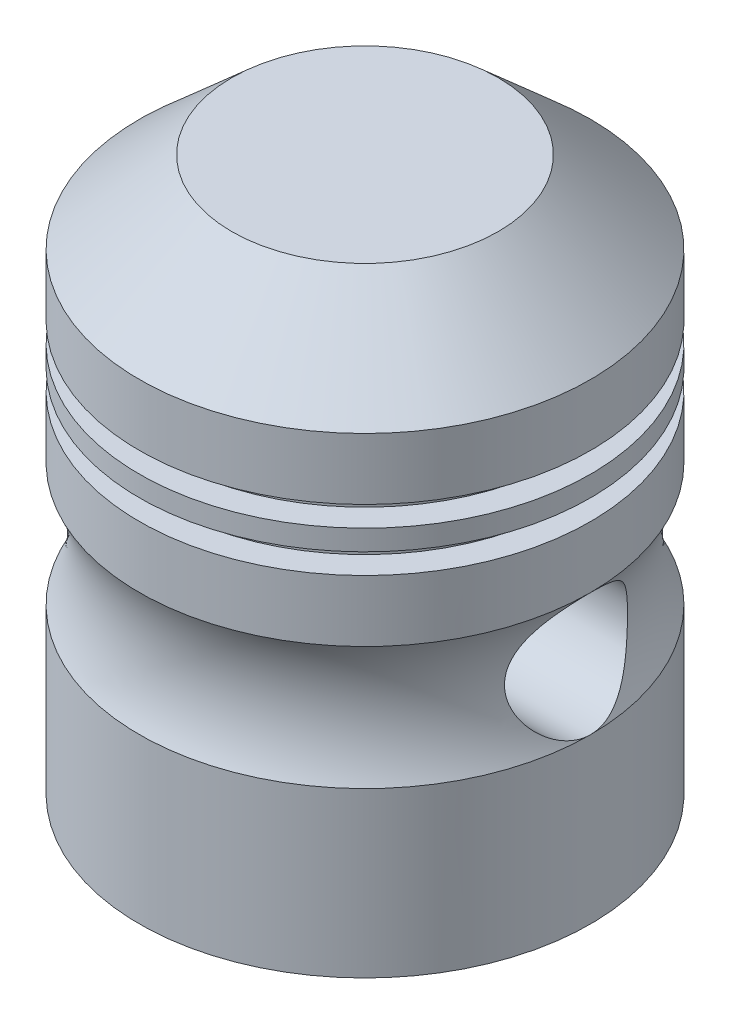
ISO-10303-21;
HEADER;
FILE_DESCRIPTION(('STEP AP214'),'2;1');
FILE_NAME('part.step','',(''),(''),'','','');
FILE_SCHEMA(('AUTOMOTIVE_DESIGN { 1 0 10303 214 1 1 1 1 }'));
ENDSEC;
DATA;
#1=APPLICATION_CONTEXT('core data for automotive mechanical design processes');
#2=APPLICATION_PROTOCOL_DEFINITION('international standard','automotive_design',2000,#1);
#3=PRODUCT_CONTEXT('',#1,'mechanical');
#4=PRODUCT('Part','Part','',(#3));
#5=PRODUCT_RELATED_PRODUCT_CATEGORY('part','',(#4));
#6=PRODUCT_DEFINITION_FORMATION('','',#4);
#7=PRODUCT_DEFINITION_CONTEXT('part definition',#1,'design');
#8=PRODUCT_DEFINITION('design','',#6,#7);
#9=PRODUCT_DEFINITION_SHAPE('','',#8);
#10=(LENGTH_UNIT() NAMED_UNIT(*) SI_UNIT(.MILLI.,.METRE.));
#11=(NAMED_UNIT(*) PLANE_ANGLE_UNIT() SI_UNIT($,.RADIAN.));
#12=(NAMED_UNIT(*) SI_UNIT($,.STERADIAN.) SOLID_ANGLE_UNIT());
#13=UNCERTAINTY_MEASURE_WITH_UNIT(LENGTH_MEASURE(1.E-05),#10,'distance_accuracy_value','');
#14=(GEOMETRIC_REPRESENTATION_CONTEXT(3) GLOBAL_UNCERTAINTY_ASSIGNED_CONTEXT((#13)) GLOBAL_UNIT_ASSIGNED_CONTEXT((#10,
#11,#12)) REPRESENTATION_CONTEXT('',''));
#15=CARTESIAN_POINT('',(0.,0.,0.));
#16=DIRECTION('',(0.,0.,1.));
#17=DIRECTION('',(1.,0.,0.));
#18=AXIS2_PLACEMENT_3D('',#15,#16,#17);
#19=CARTESIAN_POINT('',(0.,11.,0.));
#20=DIRECTION('',(0.,-1.,0.));
#21=DIRECTION('',(0.,0.,-1.));
#22=AXIS2_PLACEMENT_3D('',#19,#20,#21);
#23=TOROIDAL_SURFACE('',#22,16.630666035204,6.38);
#24=CARTESIAN_POINT('',(0.,14.,0.));
#25=DIRECTION('',(0.,-1.,0.));
#26=DIRECTION('',(0.,0.,-1.));
#27=AXIS2_PLACEMENT_3D('',#24,#25,#26);
#28=CIRCLE('',#27,11.);
#29=CARTESIAN_POINT('',(11.,14.,0.));
#30=VERTEX_POINT('',#29);
#31=CARTESIAN_POINT('',(-11.,14.,0.));
#32=VERTEX_POINT('',#31);
#33=EDGE_CURVE('E109',#30,#32,#28,.T.);
#34=ORIENTED_EDGE('',*,*,#33,.T.);
#35=CARTESIAN_POINT('',(-10.3263152954065,9.01276722768419,-2.24742205873186));
#36=CARTESIAN_POINT('',(-10.264045384223,9.13072189765893,-2.35172267161614));
#37=CARTESIAN_POINT('',(-10.202826481507,9.25722499956433,-2.44707255669149));
#38=CARTESIAN_POINT('',(-10.0879049479103,9.52638347419057,-2.617986723064));
#39=CARTESIAN_POINT('',(-10.0342087756204,9.66905253833152,-2.69353405088164));
#40=CARTESIAN_POINT('',(-9.94730762442226,9.94606675270838,-2.81218521824523));
#41=CARTESIAN_POINT('',(-9.91223800612,10.0784573032347,-2.85845381369038));
#42=CARTESIAN_POINT('',(-9.85538169319616,10.351003885103,-2.93234992862648));
#43=CARTESIAN_POINT('',(-9.83357629416875,10.4911486760032,-2.96000370351707));
#44=CARTESIAN_POINT('',(-9.80578457749439,10.7763276279369,-2.99511253309554));
#45=CARTESIAN_POINT('',(-9.79988313846749,10.9213838559895,-3.00245921519207));
#46=CARTESIAN_POINT('',(-9.80496655525806,11.2107537005662,-2.99608558052568));
#47=CARTESIAN_POINT('',(-9.81595431053624,11.3550671853115,-2.98236164645488));
#48=CARTESIAN_POINT('',(-9.85178600539391,11.6265990821925,-2.93679887529922));
#49=CARTESIAN_POINT('',(-9.87542650131291,11.7542516904468,-2.90652909699417));
#50=CARTESIAN_POINT('',(-9.93330931123812,12.0023067516625,-2.83058711656539));
#51=CARTESIAN_POINT('',(-9.96755454403756,12.1227071976648,-2.78491067368136));
#52=CARTESIAN_POINT('',(-10.0482315102398,12.3679706080987,-2.67372846514172));
#53=CARTESIAN_POINT('',(-10.0956117769021,12.4917545799967,-2.60654644398117));
#54=CARTESIAN_POINT('',(-10.1961971764195,12.7271595210252,-2.45691008890772));
#55=CARTESIAN_POINT('',(-10.2494078168901,12.8387687873668,-2.37444126268635));
#56=CARTESIAN_POINT('',(-10.3695792327478,13.071508497503,-2.17644945965596));
#57=CARTESIAN_POINT('',(-10.4370499083891,13.1895830664537,-2.05762860693477));
#58=CARTESIAN_POINT('',(-10.5687910202545,13.4051346158885,-1.80094229689642));
#59=CARTESIAN_POINT('',(-10.633061468885,13.5026116762281,-1.66307691341736));
#60=CARTESIAN_POINT('',(-10.7433398937707,13.662331790876,-1.3904346804541));
#61=CARTESIAN_POINT('',(-10.7906451242109,13.7276052633296,-1.2579649359857));
#62=CARTESIAN_POINT('',(-10.8733844976058,13.8387749977446,-0.981546398028462));
#63=CARTESIAN_POINT('',(-10.9088316688414,13.8846925403189,-0.837610419115007));
#64=CARTESIAN_POINT('',(-10.9500063733285,13.9372932975911,-0.615002448766467));
#65=CARTESIAN_POINT('',(-10.9617603561825,13.9521473369946,-0.539283032648948));
#66=CARTESIAN_POINT('',(-10.9807428041206,13.9760175130165,-0.38638511695979));
#67=CARTESIAN_POINT('',(-10.9879736012236,13.9850366580137,-0.309207390429635));
#68=CARTESIAN_POINT('',(-10.9976180733125,13.9970479894604,-0.154110288937848));
#69=CARTESIAN_POINT('',(-11.0000335562708,14.0000424379647,-0.0761912033743111));
#70=CARTESIAN_POINT('',(-10.9999656560926,13.9999565846623,0.0796155723039545));
#71=CARTESIAN_POINT('',(-10.9974828300321,13.9968769736476,0.157503264981328));
#72=CARTESIAN_POINT('',(-10.9841612118327,13.9802930894977,0.368353707983544));
#73=CARTESIAN_POINT('',(-10.9685952577036,13.9608820817041,0.500617817633106));
#74=CARTESIAN_POINT('',(-10.9249165141898,13.905337534597,0.759329587753731));
#75=CARTESIAN_POINT('',(-10.8967983969809,13.869196894072,0.885774753180593));
#76=CARTESIAN_POINT('',(-10.8292111076652,13.7798129245168,1.13628482922438));
#77=CARTESIAN_POINT('',(-10.7892733065386,13.7258499432454,1.25996305102668));
#78=CARTESIAN_POINT('',(-10.7020657532123,13.6032604103296,1.49695241027592));
#79=CARTESIAN_POINT('',(-10.6547934161136,13.5346286857708,1.61025987030153));
#80=CARTESIAN_POINT('',(-10.5459050750375,13.3684124583494,1.84819863068482));
#81=CARTESIAN_POINT('',(-10.4833520191497,13.2677749707406,1.97027481959457));
#82=CARTESIAN_POINT('',(-10.357657358931,13.0487095603818,2.19721381487103));
#83=CARTESIAN_POINT('',(-10.2945149206071,12.9302510196616,2.30204633342154));
#84=CARTESIAN_POINT('',(-10.1641987243927,12.6580799407393,2.50673601855678));
#85=CARTESIAN_POINT('',(-10.0977658499216,12.5017463018303,2.60367297054665));
#86=CARTESIAN_POINT('',(-10.0094807367113,12.2528574641704,2.7274393338393));
#87=CARTESIAN_POINT('',(-9.98195849266456,12.167547640804,2.7650734242797));
#88=CARTESIAN_POINT('',(-9.93175889540458,11.992571947222,2.83259424789255));
#89=CARTESIAN_POINT('',(-9.90907892460062,11.902908462809,2.86248516866892));
#90=CARTESIAN_POINT('',(-9.86174322565129,11.6833114825407,2.9241654621273));
#91=CARTESIAN_POINT('',(-9.83991252837936,11.5515899772833,2.95194999783677));
#92=CARTESIAN_POINT('',(-9.81020881936752,11.284155798479,2.9895589882973));
#93=CARTESIAN_POINT('',(-9.80232235361685,11.1484471006503,2.99940075531009));
#94=CARTESIAN_POINT('',(-9.80140858522562,10.8767128796064,3.00054649386312));
#95=CARTESIAN_POINT('',(-9.80840082149831,10.7406871743976,2.99182608930298));
#96=CARTESIAN_POINT('',(-9.83644508737777,10.4724796037362,2.9563579624413));
#97=CARTESIAN_POINT('',(-9.85750583728058,10.3403001754407,2.92959905897447));
#98=CARTESIAN_POINT('',(-9.91133107509696,10.0833391840399,2.85962257581617));
#99=CARTESIAN_POINT('',(-9.94406651299322,9.95854014702696,2.81644583098877));
#100=CARTESIAN_POINT('',(-10.0183097822223,9.71790928958361,2.71538142506435));
#101=CARTESIAN_POINT('',(-10.0598199356537,9.60207985393359,2.65748986908799));
#102=CARTESIAN_POINT('',(-10.1563927309257,9.36099841351461,2.51721922946773));
#103=CARTESIAN_POINT('',(-10.2125555307811,9.23765353427162,2.43232656848624));
#104=CARTESIAN_POINT('',(-10.3282630977095,9.00568302675294,2.24607913185516));
#105=CARTESIAN_POINT('',(-10.3878127254716,8.89707935182408,2.14470028712017));
#106=CARTESIAN_POINT('',(-10.5171401715682,8.67635545451292,1.90577309145127));
#107=CARTESIAN_POINT('',(-10.586693246123,8.56754341446003,1.7650159909136));
#108=CARTESIAN_POINT('',(-10.716433520679,8.37506361785204,1.46341654809096));
#109=CARTESIAN_POINT('',(-10.7766338667011,8.29136041177989,1.30260298101384));
#110=CARTESIAN_POINT('',(-10.8662723832414,8.17068541451679,1.00677649496086));
#111=CARTESIAN_POINT('',(-10.8996403081103,8.12724282482521,0.875601498657348));
#112=CARTESIAN_POINT('',(-10.9531429980598,8.05856657923531,0.606015133199726));
#113=CARTESIAN_POINT('',(-10.9732944709513,8.03330992928964,0.467613140204144));
#114=CARTESIAN_POINT('',(-10.9979889191432,8.00245300488808,0.186509582334481));
#115=CARTESIAN_POINT('',(-11.0024550865825,7.99694945460675,0.0437903019534872));
#116=CARTESIAN_POINT('',(-10.9949461424998,8.00627765609986,-0.240551362636595));
#117=CARTESIAN_POINT('',(-10.9829686954929,8.02111229650511,-0.382173588157911));
#118=CARTESIAN_POINT('',(-10.9455229941101,8.06836837009783,-0.650226660683432));
#119=CARTESIAN_POINT('',(-10.921042387194,8.09950600174936,-0.777031519159096));
#120=CARTESIAN_POINT('',(-10.8616726750347,8.17698022240466,-1.02335457469251));
#121=CARTESIAN_POINT('',(-10.8267759152535,8.22332799141103,-1.14286733493025));
#122=CARTESIAN_POINT('',(-10.7445985309007,8.33625505085822,-1.38737313283176));
#123=CARTESIAN_POINT('',(-10.6963159077698,8.40463739196357,-1.51118862241603));
#124=CARTESIAN_POINT('',(-10.5942495339901,8.5566410412111,-1.74630810988182));
#125=CARTESIAN_POINT('',(-10.5404704128864,8.64024957042721,-1.85762247390992));
#126=CARTESIAN_POINT('',(-10.4329397607902,8.81840955585396,-2.06363302001268));
#127=CARTESIAN_POINT('',(-10.3792478069992,8.91249991049685,-2.15876136698357));
#128=CARTESIAN_POINT('',(-10.3263152954065,9.01276722768419,-2.24742205873186));
#129=B_SPLINE_CURVE_WITH_KNOTS('',3,(#35,#36,#37,#38,#39,#40,#41,#42,#43,#44,#45,#46,#47,#48,
#49,#50,#51,#52,#53,#54,#55,#56,#57,#58,#59,#60,#61,#62,#63,#64,#65,#66,#67,#68,#69,#70,#71,#72,
#73,#74,#75,#76,#77,#78,#79,#80,#81,#82,#83,#84,#85,#86,#87,#88,#89,#90,#91,#92,#93,#94,#95,#96,
#97,#98,#99,#100,#101,#102,#103,#104,#105,#106,#107,#108,#109,#110,#111,#112,#113,#114,#115,
#116,#117,#118,#119,#120,#121,#122,#123,#124,#125,#126,#127,#128),.UNSPECIFIED.,.T.,.F.,(4,2,2,
2,2,2,2,2,2,2,2,2,2,2,2,2,2,2,2,2,2,2,2,2,2,2,2,2,2,2,2,2,2,2,2,2,2,2,2,2,2,2,2,2,2,2,4),(0.,
0.507567710179697,1.01556855326931,1.44747053789229,1.87876205979902,2.31235084602799,
2.7460140771384,3.1443010189624,3.54269768081409,3.98690800795042,4.43154163261587,
4.97111904749818,5.51069437042814,5.97416414935286,6.43712303529254,6.67097521622139,
6.90470673038722,7.13835047046823,7.37196764019569,7.7736896742167,8.17558238339601,
8.59623690816472,9.01704002172166,9.5254680648746,10.0347798196333,10.6178652237925,
10.9090857632181,11.2001484765362,11.6073936552084,12.0142456908778,12.4216323398613,
12.8292717399745,13.2359038117908,13.6426436277793,14.1206777979735,14.5994162476829,
15.1698187774163,15.7394121613909,16.1641634727794,16.5883767869831,17.014664516205,
17.4410127972953,17.8379498848327,18.235179391468,18.6819842935531,19.1284159182511,
19.5598736350294),.UNSPECIFIED.);
#130=CARTESIAN_POINT('',(-11.,8.,0.));
#131=VERTEX_POINT('',#130);
#132=EDGE_CURVE('E66',#32,#131,#129,.T.);
#133=ORIENTED_EDGE('',*,*,#132,.T.);
#134=CARTESIAN_POINT('',(0.,8.,0.));
#135=DIRECTION('',(0.,-1.,0.));
#136=DIRECTION('',(0.,0.,-1.));
#137=AXIS2_PLACEMENT_3D('',#134,#135,#136);
#138=CIRCLE('',#137,11.);
#139=CARTESIAN_POINT('',(11.,8.,0.));
#140=VERTEX_POINT('',#139);
#141=EDGE_CURVE('E107',#140,#131,#138,.T.);
#142=ORIENTED_EDGE('',*,*,#141,.F.);
#143=CARTESIAN_POINT('',(10.3263152954065,9.01276722768419,-2.24742205873186));
#144=CARTESIAN_POINT('',(10.3933917463976,8.8857047394798,-2.13507356877632));
#145=CARTESIAN_POINT('',(10.4617754021983,8.76840765554203,-2.0121971784252));
#146=CARTESIAN_POINT('',(10.594514094137,8.55507061315099,-1.7468112757681));
#147=CARTESIAN_POINT('',(10.6588612691946,8.45907126340967,-1.60426508364461));
#148=CARTESIAN_POINT('',(10.7666794049041,8.30513825717933,-1.32614570023864));
#149=CARTESIAN_POINT('',(10.811843363299,8.24354327217151,-1.19326621082124));
#150=CARTESIAN_POINT('',(10.8898559242438,8.13970521740502,-0.916734458721477));
#151=CARTESIAN_POINT('',(10.9227249000778,8.09743010781708,-0.773100495013366));
#152=CARTESIAN_POINT('',(10.9599211020106,8.050158665747,-0.551580041364393));
#153=CARTESIAN_POINT('',(10.9703225629837,8.03706803804237,-0.476346486055227));
#154=CARTESIAN_POINT('',(10.9866229255091,8.01663653694972,-0.324634618825459));
#155=CARTESIAN_POINT('',(10.9925240645449,8.00929280625479,-0.2481569448022));
#156=CARTESIAN_POINT('',(10.9995877385574,8.00050834002653,-0.0946515922697008));
#157=CARTESIAN_POINT('',(11.0007508281892,7.99906691354576,-0.0176239791961436));
#158=CARTESIAN_POINT('',(10.9983051393701,8.0021051562819,0.136213449299295));
#159=CARTESIAN_POINT('',(10.9946968244533,8.00658425032992,0.213023285151443));
#160=CARTESIAN_POINT('',(10.9784665724253,8.02682574683408,0.421739036138954));
#161=CARTESIAN_POINT('',(10.961177303361,8.04845104911575,0.55277588570956));
#162=CARTESIAN_POINT('',(10.9144923845898,8.10806168430979,0.808714698621161));
#163=CARTESIAN_POINT('',(10.8850920298414,8.14605337567138,0.933614256552078));
#164=CARTESIAN_POINT('',(10.8148269496898,8.23956438564801,1.18269769418146));
#165=CARTESIAN_POINT('',(10.7733632340923,8.29602636764814,1.30635456722868));
#166=CARTESIAN_POINT('',(10.6834049293122,8.42369155100757,1.54296485454099));
#167=CARTESIAN_POINT('',(10.6349074637767,8.49490078817185,1.65591385857457));
#168=CARTESIAN_POINT('',(10.5235527819024,8.66718339697248,1.89307969231333));
#169=CARTESIAN_POINT('',(10.459828431725,8.77138765998076,2.01462392682742));
#170=CARTESIAN_POINT('',(10.3324762338183,8.99788282032632,2.2398946080976));
#171=CARTESIAN_POINT('',(10.2688487453706,9.12020478570224,2.34358977366926));
#172=CARTESIAN_POINT('',(10.1392943022996,9.39923864608015,2.54375633175091));
#173=CARTESIAN_POINT('',(10.0741661200112,9.55835773110817,2.63748254936249));
#174=CARTESIAN_POINT('',(9.98870631765977,9.81112512700913,2.75594413192385));
#175=CARTESIAN_POINT('',(9.96227154645652,9.89766884449589,2.79172744439712));
#176=CARTESIAN_POINT('',(9.91452988092541,10.0749564082433,2.8553737268237));
#177=CARTESIAN_POINT('',(9.89322011351637,10.1656978670652,2.88324113603308));
#178=CARTESIAN_POINT('',(9.849660201076,10.3867159558056,2.93963234357262));
#179=CARTESIAN_POINT('',(9.83027761011108,10.5186232931251,2.96418279569747));
#180=CARTESIAN_POINT('',(9.80558053450952,10.7857491932024,2.99535597716971));
#181=CARTESIAN_POINT('',(9.80025391450747,10.9209647978563,3.00199417135888));
#182=CARTESIAN_POINT('',(9.80426711356718,11.1909138457125,2.99696266906163));
#183=CARTESIAN_POINT('',(9.81361568330632,11.3256469531831,2.98528204924289));
#184=CARTESIAN_POINT('',(9.84589810141259,11.5907464385382,2.94432360277233));
#185=CARTESIAN_POINT('',(9.86884084448048,11.7211098982925,2.9150342545027));
#186=CARTESIAN_POINT('',(9.92626816813045,11.9760558983832,2.83993154863749));
#187=CARTESIAN_POINT('',(9.96089245295973,12.1005466176772,2.79391763397088));
#188=CARTESIAN_POINT('',(10.0385525074496,12.3401850832023,2.6872162611902));
#189=CARTESIAN_POINT('',(10.0815905983488,12.4553302387032,2.62652475265774));
#190=CARTESIAN_POINT('',(10.1814613621025,12.695635202833,2.47954871629627));
#191=CARTESIAN_POINT('',(10.2393738487708,12.8187191196688,2.39060783523531));
#192=CARTESIAN_POINT('',(10.3579488695582,13.0495507193084,2.19594735906844));
#193=CARTESIAN_POINT('',(10.4186155783746,13.1572740216221,2.0902016414376));
#194=CARTESIAN_POINT('',(10.5488847753257,13.3743062426753,1.84242346576462));
#195=CARTESIAN_POINT('',(10.6181059493074,13.4803409504906,1.69728922581117));
#196=CARTESIAN_POINT('',(10.7457049864045,13.6662747052246,1.38692019418582));
#197=CARTESIAN_POINT('',(10.804101847102,13.7462197330178,1.22172147755572));
#198=CARTESIAN_POINT('',(10.8882921983389,13.8581617691113,0.921505518342532));
#199=CARTESIAN_POINT('',(10.9186321586699,13.8972799197278,0.790421941549008));
#200=CARTESIAN_POINT('',(10.9658537482747,13.9574516227471,0.521873258854858));
#201=CARTESIAN_POINT('',(10.9827520687111,13.9785275815375,0.384416292403601));
#202=CARTESIAN_POINT('',(11.0010856033726,14.0013722434302,0.106295741665881));
#203=CARTESIAN_POINT('',(11.002459797133,14.0030647566563,-0.0343783201831812));
#204=CARTESIAN_POINT('',(10.9893998398906,13.9868204969092,-0.31386679101944));
#205=CARTESIAN_POINT('',(10.9749595970955,13.9688761597346,-0.452680462519647));
#206=CARTESIAN_POINT('',(10.9332261546121,13.9159701803805,-0.717205030065799));
#207=CARTESIAN_POINT('',(10.9066418723164,13.8819439554215,-0.843221775751949));
#208=CARTESIAN_POINT('',(10.8435167398167,13.7989198416671,-1.08752588489771));
#209=CARTESIAN_POINT('',(10.8069731065904,13.7499177675834,-1.20581107639454));
#210=CARTESIAN_POINT('',(10.721206701674,13.630728053717,-1.44917795342432));
#211=CARTESIAN_POINT('',(10.6709256345632,13.5585364855913,-1.57289842283333));
#212=CARTESIAN_POINT('',(10.5652905768578,13.398568258661,-1.80750282802792));
#213=CARTESIAN_POINT('',(10.5099309427499,13.3107741576502,-1.91837216583482));
#214=CARTESIAN_POINT('',(10.386108864114,13.1006249788506,-2.14862475216774));
#215=CARTESIAN_POINT('',(10.3173665634785,12.9748913897136,-2.26479353394749));
#216=CARTESIAN_POINT('',(10.184966263668,12.7038097063698,-2.47515987121199));
#217=CARTESIAN_POINT('',(10.1213061871778,12.5584696921372,-2.56936643411162));
#218=CARTESIAN_POINT('',(10.0167546810305,12.2780680205437,-2.71788862105594));
#219=CARTESIAN_POINT('',(9.97382818964114,12.1459655049336,-2.77634592686699));
#220=CARTESIAN_POINT('',(9.90033033751952,11.8715713476909,-2.87427751531334));
#221=CARTESIAN_POINT('',(9.86974447212918,11.7292919006338,-2.91377409402795));
#222=CARTESIAN_POINT('',(9.83575584493115,11.5103924914322,-2.95721632180877));
#223=CARTESIAN_POINT('',(9.82639344801834,11.436174193173,-2.96908008200791));
#224=CARTESIAN_POINT('',(9.81202938606174,11.2866531488518,-2.98722083758651));
#225=CARTESIAN_POINT('',(9.80702565636476,11.2113509334319,-2.99350047813206));
#226=CARTESIAN_POINT('',(9.8015705386663,11.0603337316721,-3.00034531926255));
#227=CARTESIAN_POINT('',(9.80111838301037,10.984618817092,-3.00091148346483));
#228=CARTESIAN_POINT('',(9.80476992366651,10.8334957514113,-2.99633102358987));
#229=CARTESIAN_POINT('',(9.80887325692832,10.7580875763459,-2.99118485475773));
#230=CARTESIAN_POINT('',(9.82634569894496,10.5509008020044,-2.96916578396681));
#231=CARTESIAN_POINT('',(9.84439955805769,10.4200863185013,-2.94633642814809));
#232=CARTESIAN_POINT('',(9.89240517624448,10.1647082392087,-2.88437481906835));
#233=CARTESIAN_POINT('',(9.92236616778797,10.0401495786291,-2.84522991401931));
#234=CARTESIAN_POINT('',(9.9938422823995,9.79104925168739,-2.74908701998266));
#235=CARTESIAN_POINT('',(10.0360138198177,9.66710602233738,-2.69104047621526));
#236=CARTESIAN_POINT('',(10.1272575449687,9.4303179973395,-2.56015487994935));
#237=CARTESIAN_POINT('',(10.1763222433017,9.31746137930145,-2.48733184441323));
#238=CARTESIAN_POINT('',(10.2596127255638,9.14217754688721,-2.35706267192646));
#239=CARTESIAN_POINT('',(10.2928008414349,9.07625344154182,-2.30355648802484));
#240=CARTESIAN_POINT('',(10.3263152954065,9.01276722768419,-2.24742205873186));
#241=B_SPLINE_CURVE_WITH_KNOTS('',3,(#143,#144,#145,#146,#147,#148,#149,#150,#151,#152,#153,
#154,#155,#156,#157,#158,#159,#160,#161,#162,#163,#164,#165,#166,#167,#168,#169,#170,#171,#172,
#173,#174,#175,#176,#177,#178,#179,#180,#181,#182,#183,#184,#185,#186,#187,#188,#189,#190,#191,
#192,#193,#194,#195,#196,#197,#198,#199,#200,#201,#202,#203,#204,#205,#206,#207,#208,#209,#210,
#211,#212,#213,#214,#215,#216,#217,#218,#219,#220,#221,#222,#223,#224,#225,#226,#227,#228,#229,
#230,#231,#232,#233,#234,#235,#236,#237,#238,#239,#240),.UNSPECIFIED.,.T.,.F.,(4,2,2,2,2,2,2,2,
2,2,2,2,2,2,2,2,2,2,2,2,2,2,2,2,2,2,2,2,2,2,2,2,2,2,2,2,2,2,2,2,2,2,2,2,2,2,2,2,4),(0.,
0.546928852921341,1.09489174786802,1.55294257646267,2.01023099813789,2.2411375946414,
2.4719293133361,2.70269401385278,2.93343629760409,3.33325412158072,3.73322741768181,
4.15806120667744,4.5830692178942,5.09800456316206,5.61383336211058,6.19752543350985,
6.48899660575832,6.78030399615537,7.18509274643408,7.58953190371544,7.99421231587845,
8.39915780426704,8.80912879208651,9.21921304456577,9.70500865271588,10.1915669356581,
10.7666085327539,11.3406311242016,11.759282479481,12.1774131591377,12.597186809903,
13.0171222162678,13.4151766013455,13.8133423322386,14.267165502062,14.7214992331472,
15.2725813870555,15.8234371251934,16.2738362831036,16.7237045075689,16.9506424085004,
17.1774727528715,17.4042648400956,17.6310388543935,18.0311285737443,18.4315291190153,
18.859655809541,19.2873208881444,19.5605914860381),.UNSPECIFIED.);
#242=EDGE_CURVE('E59',#140,#30,#241,.T.);
#243=ORIENTED_EDGE('',*,*,#242,.T.);
#244=EDGE_LOOP('',(#34,#133,#142,#243));
#245=FACE_BOUND('',#244,.T.);
#246=ADVANCED_FACE('F43',(#245),#23,.F.);
#247=CARTESIAN_POINT('',(-9.75,6.,0.));
#248=DIRECTION('',(0.,1.,0.));
#249=DIRECTION('',(0.,0.,1.));
#250=AXIS2_PLACEMENT_3D('',#247,#248,#249);
#251=PLANE('',#250);
#252=CARTESIAN_POINT('',(0.,6.,0.));
#253=DIRECTION('',(0.,-1.,0.));
#254=DIRECTION('',(0.,0.,-1.));
#255=AXIS2_PLACEMENT_3D('',#252,#253,#254);
#256=CIRCLE('',#255,9.75);
#257=CARTESIAN_POINT('',(0.,6.,-9.75));
#258=VERTEX_POINT('',#257);
#259=EDGE_CURVE('E132',#258,#258,#256,.T.);
#260=ORIENTED_EDGE('',*,*,#259,.T.);
#261=EDGE_LOOP('',(#260));
#262=FACE_BOUND('',#261,.T.);
#263=CARTESIAN_POINT('',(0.,6.,3.5));
#264=DIRECTION('',(0.,1.,0.));
#265=DIRECTION('',(0.,0.,1.));
#266=AXIS2_PLACEMENT_3D('',#263,#264,#265);
#267=CIRCLE('',#266,5.);
#268=CARTESIAN_POINT('',(5.,6.,3.5));
#269=VERTEX_POINT('',#268);
#270=CARTESIAN_POINT('',(-5.,6.,3.5));
#271=VERTEX_POINT('',#270);
#272=EDGE_CURVE('E11',#269,#271,#267,.F.);
#273=ORIENTED_EDGE('',*,*,#272,.F.);
#274=DIRECTION('',(0.,0.,1.));
#275=VECTOR('',#274,1.);
#276=CARTESIAN_POINT('',(5.,6.,0.));
#277=LINE('',#276,#275);
#278=CARTESIAN_POINT('',(5.,6.,-3.5));
#279=VERTEX_POINT('',#278);
#280=EDGE_CURVE('E53',#279,#269,#277,.T.);
#281=ORIENTED_EDGE('',*,*,#280,.F.);
#282=CARTESIAN_POINT('',(0.,6.,-3.5));
#283=DIRECTION('',(0.,1.,0.));
#284=DIRECTION('',(0.,0.,1.));
#285=AXIS2_PLACEMENT_3D('',#282,#283,#284);
#286=CIRCLE('',#285,5.);
#287=CARTESIAN_POINT('',(-5.,6.,-3.5));
#288=VERTEX_POINT('',#287);
#289=EDGE_CURVE('E139',#288,#279,#286,.F.);
#290=ORIENTED_EDGE('',*,*,#289,.F.);
#291=DIRECTION('',(0.,0.,-1.));
#292=VECTOR('',#291,1.);
#293=CARTESIAN_POINT('',(-5.,6.,0.));
#294=LINE('',#293,#292);
#295=EDGE_CURVE('E136',#271,#288,#294,.T.);
#296=ORIENTED_EDGE('',*,*,#295,.F.);
#297=EDGE_LOOP('',(#273,#281,#290,#296));
#298=FACE_BOUND('',#297,.T.);
#299=ADVANCED_FACE('F45',(#262,#298),#251,.F.);
#300=CARTESIAN_POINT('',(0.,-30.9574468085107,0.));
#301=DIRECTION('',(0.,-1.,0.));
#302=DIRECTION('',(0.,0.,-1.));
#303=AXIS2_PLACEMENT_3D('',#300,#301,#302);
#304=CYLINDRICAL_SURFACE('',#303,9.75);
#305=ORIENTED_EDGE('',*,*,#259,.F.);
#306=EDGE_LOOP('',(#305));
#307=FACE_BOUND('',#306,.T.);
#308=CARTESIAN_POINT('',(0.,0.,0.));
#309=DIRECTION('',(0.,-1.,0.));
#310=DIRECTION('',(0.,0.,-1.));
#311=AXIS2_PLACEMENT_3D('',#308,#309,#310);
#312=CIRCLE('',#311,9.75);
#313=CARTESIAN_POINT('',(0.,0.,-9.75));
#314=VERTEX_POINT('',#313);
#315=EDGE_CURVE('E124',#314,#314,#312,.T.);
#316=ORIENTED_EDGE('',*,*,#315,.T.);
#317=EDGE_LOOP('',(#316));
#318=FACE_BOUND('',#317,.T.);
#319=ADVANCED_FACE('F243',(#307,#318),#304,.F.);
#320=CARTESIAN_POINT('',(-11.,0.,0.));
#321=DIRECTION('',(0.,1.,0.));
#322=DIRECTION('',(0.,0.,1.));
#323=AXIS2_PLACEMENT_3D('',#320,#321,#322);
#324=PLANE('',#323);
#325=ORIENTED_EDGE('',*,*,#315,.F.);
#326=EDGE_LOOP('',(#325));
#327=FACE_BOUND('',#326,.T.);
#328=CARTESIAN_POINT('',(0.,0.,0.));
#329=DIRECTION('',(0.,-1.,0.));
#330=DIRECTION('',(0.,0.,-1.));
#331=AXIS2_PLACEMENT_3D('',#328,#329,#330);
#332=CIRCLE('',#331,11.);
#333=CARTESIAN_POINT('',(0.,0.,-11.));
#334=VERTEX_POINT('',#333);
#335=EDGE_CURVE('E121',#334,#334,#332,.T.);
#336=ORIENTED_EDGE('',*,*,#335,.T.);
#337=EDGE_LOOP('',(#336));
#338=FACE_BOUND('',#337,.T.);
#339=ADVANCED_FACE('F502',(#327,#338),#324,.F.);
#340=CARTESIAN_POINT('',(0.,-30.9574468085107,0.));
#341=DIRECTION('',(0.,-1.,0.));
#342=DIRECTION('',(0.,0.,-1.));
#343=AXIS2_PLACEMENT_3D('',#340,#341,#342);
#344=CYLINDRICAL_SURFACE('',#343,11.);
#345=ORIENTED_EDGE('',*,*,#335,.F.);
#346=EDGE_LOOP('',(#345));
#347=FACE_BOUND('',#346,.T.);
#348=ORIENTED_EDGE('',*,*,#141,.T.);
#349=EDGE_CURVE('E113',#131,#140,#138,.T.);
#350=ORIENTED_EDGE('',*,*,#349,.T.);
#351=EDGE_LOOP('',(#348,#350));
#352=FACE_BOUND('',#351,.T.);
#353=ADVANCED_FACE('F119',(#347,#352),#344,.T.);
#354=ORIENTED_EDGE('',*,*,#349,.F.);
#355=EDGE_CURVE('E95',#131,#32,#129,.T.);
#356=ORIENTED_EDGE('',*,*,#355,.T.);
#357=EDGE_CURVE('E221',#32,#30,#28,.T.);
#358=ORIENTED_EDGE('',*,*,#357,.T.);
#359=EDGE_CURVE('E115',#30,#140,#241,.T.);
#360=ORIENTED_EDGE('',*,*,#359,.T.);
#361=EDGE_LOOP('',(#354,#356,#358,#360));
#362=FACE_BOUND('',#361,.T.);
#363=ADVANCED_FACE('F114',(#362),#23,.F.);
#364=CARTESIAN_POINT('',(0.,-30.9574468085107,0.));
#365=DIRECTION('',(0.,-1.,0.));
#366=DIRECTION('',(0.,0.,-1.));
#367=AXIS2_PLACEMENT_3D('',#364,#365,#366);
#368=CYLINDRICAL_SURFACE('',#367,11.);
#369=ORIENTED_EDGE('',*,*,#33,.F.);
#370=ORIENTED_EDGE('',*,*,#357,.F.);
#371=EDGE_LOOP('',(#369,#370));
#372=FACE_BOUND('',#371,.T.);
#373=CARTESIAN_POINT('',(0.,17.,0.));
#374=DIRECTION('',(0.,-1.,0.));
#375=DIRECTION('',(0.,0.,-1.));
#376=AXIS2_PLACEMENT_3D('',#373,#374,#375);
#377=CIRCLE('',#376,11.);
#378=CARTESIAN_POINT('',(0.,17.,-11.));
#379=VERTEX_POINT('',#378);
#380=EDGE_CURVE('E218',#379,#379,#377,.T.);
#381=ORIENTED_EDGE('',*,*,#380,.T.);
#382=EDGE_LOOP('',(#381));
#383=FACE_BOUND('',#382,.T.);
#384=ADVANCED_FACE('F227',(#372,#383),#368,.T.);
#385=CARTESIAN_POINT('',(-9.75,17.,0.));
#386=DIRECTION('',(0.,-1.,0.));
#387=DIRECTION('',(0.,0.,-1.));
#388=AXIS2_PLACEMENT_3D('',#385,#386,#387);
#389=PLANE('',#388);
#390=ORIENTED_EDGE('',*,*,#380,.F.);
#391=EDGE_LOOP('',(#390));
#392=FACE_BOUND('',#391,.T.);
#393=CARTESIAN_POINT('',(0.,17.,0.));
#394=DIRECTION('',(0.,-1.,0.));
#395=DIRECTION('',(0.,0.,-1.));
#396=AXIS2_PLACEMENT_3D('',#393,#394,#395);
#397=CIRCLE('',#396,9.75);
#398=CARTESIAN_POINT('',(0.,17.,-9.75));
#399=VERTEX_POINT('',#398);
#400=EDGE_CURVE('E215',#399,#399,#397,.T.);
#401=ORIENTED_EDGE('',*,*,#400,.T.);
#402=EDGE_LOOP('',(#401));
#403=FACE_BOUND('',#402,.T.);
#404=ADVANCED_FACE('F229',(#392,#403),#389,.F.);
#405=CARTESIAN_POINT('',(0.,-30.9574468085107,0.));
#406=DIRECTION('',(0.,-1.,0.));
#407=DIRECTION('',(0.,0.,-1.));
#408=AXIS2_PLACEMENT_3D('',#405,#406,#407);
#409=CYLINDRICAL_SURFACE('',#408,9.75);
#410=ORIENTED_EDGE('',*,*,#400,.F.);
#411=EDGE_LOOP('',(#410));
#412=FACE_BOUND('',#411,.T.);
#413=CARTESIAN_POINT('',(0.,18.,0.));
#414=DIRECTION('',(0.,-1.,0.));
#415=DIRECTION('',(0.,0.,-1.));
#416=AXIS2_PLACEMENT_3D('',#413,#414,#415);
#417=CIRCLE('',#416,9.75);
#418=CARTESIAN_POINT('',(0.,18.,-9.75));
#419=VERTEX_POINT('',#418);
#420=EDGE_CURVE('E211',#419,#419,#417,.T.);
#421=ORIENTED_EDGE('',*,*,#420,.T.);
#422=EDGE_LOOP('',(#421));
#423=FACE_BOUND('',#422,.T.);
#424=ADVANCED_FACE('F235',(#412,#423),#409,.T.);
#425=CARTESIAN_POINT('',(-11.,18.,0.));
#426=DIRECTION('',(0.,1.,0.));
#427=DIRECTION('',(0.,0.,1.));
#428=AXIS2_PLACEMENT_3D('',#425,#426,#427);
#429=PLANE('',#428);
#430=ORIENTED_EDGE('',*,*,#420,.F.);
#431=EDGE_LOOP('',(#430));
#432=FACE_BOUND('',#431,.T.);
#433=CARTESIAN_POINT('',(0.,18.,0.));
#434=DIRECTION('',(0.,-1.,0.));
#435=DIRECTION('',(0.,0.,-1.));
#436=AXIS2_PLACEMENT_3D('',#433,#434,#435);
#437=CIRCLE('',#436,11.);
#438=CARTESIAN_POINT('',(0.,18.,-11.));
#439=VERTEX_POINT('',#438);
#440=EDGE_CURVE('E207',#439,#439,#437,.T.);
#441=ORIENTED_EDGE('',*,*,#440,.T.);
#442=EDGE_LOOP('',(#441));
#443=FACE_BOUND('',#442,.T.);
#444=ADVANCED_FACE('F307',(#432,#443),#429,.F.);
#445=CARTESIAN_POINT('',(0.,-30.9574468085107,0.));
#446=DIRECTION('',(0.,-1.,0.));
#447=DIRECTION('',(0.,0.,-1.));
#448=AXIS2_PLACEMENT_3D('',#445,#446,#447);
#449=CYLINDRICAL_SURFACE('',#448,11.);
#450=ORIENTED_EDGE('',*,*,#440,.F.);
#451=EDGE_LOOP('',(#450));
#452=FACE_BOUND('',#451,.T.);
#453=CARTESIAN_POINT('',(0.,19.,0.));
#454=DIRECTION('',(0.,-1.,0.));
#455=DIRECTION('',(0.,0.,-1.));
#456=AXIS2_PLACEMENT_3D('',#453,#454,#455);
#457=CIRCLE('',#456,11.);
#458=CARTESIAN_POINT('',(0.,19.,-11.));
#459=VERTEX_POINT('',#458);
#460=EDGE_CURVE('E203',#459,#459,#457,.T.);
#461=ORIENTED_EDGE('',*,*,#460,.T.);
#462=EDGE_LOOP('',(#461));
#463=FACE_BOUND('',#462,.T.);
#464=ADVANCED_FACE('F303',(#452,#463),#449,.T.);
#465=CARTESIAN_POINT('',(-9.75,19.,0.));
#466=DIRECTION('',(0.,-1.,0.));
#467=DIRECTION('',(0.,0.,-1.));
#468=AXIS2_PLACEMENT_3D('',#465,#466,#467);
#469=PLANE('',#468);
#470=ORIENTED_EDGE('',*,*,#460,.F.);
#471=EDGE_LOOP('',(#470));
#472=FACE_BOUND('',#471,.T.);
#473=CARTESIAN_POINT('',(0.,19.,0.));
#474=DIRECTION('',(0.,-1.,0.));
#475=DIRECTION('',(0.,0.,-1.));
#476=AXIS2_PLACEMENT_3D('',#473,#474,#475);
#477=CIRCLE('',#476,9.75);
#478=CARTESIAN_POINT('',(0.,19.,-9.75));
#479=VERTEX_POINT('',#478);
#480=EDGE_CURVE('E199',#479,#479,#477,.T.);
#481=ORIENTED_EDGE('',*,*,#480,.T.);
#482=EDGE_LOOP('',(#481));
#483=FACE_BOUND('',#482,.T.);
#484=ADVANCED_FACE('F299',(#472,#483),#469,.F.);
#485=CARTESIAN_POINT('',(0.,-30.9574468085107,0.));
#486=DIRECTION('',(0.,-1.,0.));
#487=DIRECTION('',(0.,0.,-1.));
#488=AXIS2_PLACEMENT_3D('',#485,#486,#487);
#489=CYLINDRICAL_SURFACE('',#488,9.75);
#490=ORIENTED_EDGE('',*,*,#480,.F.);
#491=EDGE_LOOP('',(#490));
#492=FACE_BOUND('',#491,.T.);
#493=CARTESIAN_POINT('',(0.,20.,0.));
#494=DIRECTION('',(0.,-1.,0.));
#495=DIRECTION('',(0.,0.,-1.));
#496=AXIS2_PLACEMENT_3D('',#493,#494,#495);
#497=CIRCLE('',#496,9.75);
#498=CARTESIAN_POINT('',(0.,20.,-9.75));
#499=VERTEX_POINT('',#498);
#500=EDGE_CURVE('E195',#499,#499,#497,.T.);
#501=ORIENTED_EDGE('',*,*,#500,.T.);
#502=EDGE_LOOP('',(#501));
#503=FACE_BOUND('',#502,.T.);
#504=ADVANCED_FACE('F295',(#492,#503),#489,.T.);
#505=CARTESIAN_POINT('',(-11.,20.,0.));
#506=DIRECTION('',(0.,1.,0.));
#507=DIRECTION('',(0.,0.,1.));
#508=AXIS2_PLACEMENT_3D('',#505,#506,#507);
#509=PLANE('',#508);
#510=ORIENTED_EDGE('',*,*,#500,.F.);
#511=EDGE_LOOP('',(#510));
#512=FACE_BOUND('',#511,.T.);
#513=CARTESIAN_POINT('',(0.,20.,0.));
#514=DIRECTION('',(0.,-1.,0.));
#515=DIRECTION('',(0.,0.,-1.));
#516=AXIS2_PLACEMENT_3D('',#513,#514,#515);
#517=CIRCLE('',#516,11.);
#518=CARTESIAN_POINT('',(0.,20.,-11.));
#519=VERTEX_POINT('',#518);
#520=EDGE_CURVE('E191',#519,#519,#517,.T.);
#521=ORIENTED_EDGE('',*,*,#520,.T.);
#522=EDGE_LOOP('',(#521));
#523=FACE_BOUND('',#522,.T.);
#524=ADVANCED_FACE('F291',(#512,#523),#509,.F.);
#525=CARTESIAN_POINT('',(0.,-30.9574468085107,0.));
#526=DIRECTION('',(0.,-1.,0.));
#527=DIRECTION('',(0.,0.,-1.));
#528=AXIS2_PLACEMENT_3D('',#525,#526,#527);
#529=CYLINDRICAL_SURFACE('',#528,11.);
#530=ORIENTED_EDGE('',*,*,#520,.F.);
#531=EDGE_LOOP('',(#530));
#532=FACE_BOUND('',#531,.T.);
#533=CARTESIAN_POINT('',(0.,23.,0.));
#534=DIRECTION('',(0.,-1.,0.));
#535=DIRECTION('',(0.,0.,-1.));
#536=AXIS2_PLACEMENT_3D('',#533,#534,#535);
#537=CIRCLE('',#536,11.);
#538=CARTESIAN_POINT('',(0.,23.,-11.));
#539=VERTEX_POINT('',#538);
#540=EDGE_CURVE('E187',#539,#539,#537,.T.);
#541=ORIENTED_EDGE('',*,*,#540,.T.);
#542=EDGE_LOOP('',(#541));
#543=FACE_BOUND('',#542,.T.);
#544=ADVANCED_FACE('F287',(#532,#543),#529,.T.);
#545=CARTESIAN_POINT('',(0.,27.,0.));
#546=DIRECTION('',(0.,-1.,0.));
#547=DIRECTION('',(0.,0.,-1.));
#548=AXIS2_PLACEMENT_3D('',#545,#546,#547);
#549=CONICAL_SURFACE('',#548,6.5,0.84415398611317);
#550=ORIENTED_EDGE('',*,*,#540,.F.);
#551=EDGE_LOOP('',(#550));
#552=FACE_BOUND('',#551,.T.);
#553=CARTESIAN_POINT('',(0.,27.,0.));
#554=DIRECTION('',(0.,-1.,0.));
#555=DIRECTION('',(0.,0.,-1.));
#556=AXIS2_PLACEMENT_3D('',#553,#554,#555);
#557=CIRCLE('',#556,6.5);
#558=CARTESIAN_POINT('',(0.,27.,-6.5));
#559=VERTEX_POINT('',#558);
#560=EDGE_CURVE('E162',#559,#559,#557,.T.);
#561=ORIENTED_EDGE('',*,*,#560,.T.);
#562=EDGE_LOOP('',(#561));
#563=FACE_BOUND('',#562,.T.);
#564=ADVANCED_FACE('F283',(#552,#563),#549,.T.);
#565=CARTESIAN_POINT('',(0.,27.,0.));
#566=DIRECTION('',(0.,-1.,0.));
#567=DIRECTION('',(0.,0.,-1.));
#568=AXIS2_PLACEMENT_3D('',#565,#566,#567);
#569=PLANE('',#568);
#570=ORIENTED_EDGE('',*,*,#560,.F.);
#571=EDGE_LOOP('',(#570));
#572=FACE_BOUND('',#571,.T.);
#573=ADVANCED_FACE('F280',(#572),#569,.F.);
#574=CARTESIAN_POINT('',(0.,19.,3.5));
#575=DIRECTION('',(0.,-1.,0.));
#576=DIRECTION('',(0.,0.,-1.));
#577=AXIS2_PLACEMENT_3D('',#574,#575,#576);
#578=CYLINDRICAL_SURFACE('',#577,5.);
#579=ORIENTED_EDGE('',*,*,#272,.T.);
#580=DIRECTION('',(0.,-1.,0.));
#581=VECTOR('',#580,1.);
#582=CARTESIAN_POINT('',(-5.,19.,3.5));
#583=LINE('',#582,#581);
#584=CARTESIAN_POINT('',(-5.,19.,3.5));
#585=VERTEX_POINT('',#584);
#586=EDGE_CURVE('E170',#585,#271,#583,.T.);
#587=ORIENTED_EDGE('',*,*,#586,.F.);
#588=CARTESIAN_POINT('',(0.,19.,3.5));
#589=DIRECTION('',(0.,1.,0.));
#590=DIRECTION('',(0.,0.,1.));
#591=AXIS2_PLACEMENT_3D('',#588,#589,#590);
#592=CIRCLE('',#591,5.);
#593=CARTESIAN_POINT('',(5.,19.,3.5));
#594=VERTEX_POINT('',#593);
#595=EDGE_CURVE('E111',#585,#594,#592,.T.);
#596=ORIENTED_EDGE('',*,*,#595,.T.);
#597=DIRECTION('',(0.,-1.,0.));
#598=VECTOR('',#597,1.);
#599=CARTESIAN_POINT('',(5.,19.,3.5));
#600=LINE('',#599,#598);
#601=EDGE_CURVE('E149',#594,#269,#600,.T.);
#602=ORIENTED_EDGE('',*,*,#601,.T.);
#603=EDGE_LOOP('',(#579,#587,#596,#602));
#604=FACE_BOUND('',#603,.T.);
#605=ADVANCED_FACE('F157',(#604),#578,.F.);
#606=CARTESIAN_POINT('',(5.,19.,3.5));
#607=DIRECTION('',(-1.,0.,0.));
#608=DIRECTION('',(0.,0.,1.));
#609=AXIS2_PLACEMENT_3D('',#606,#607,#608);
#610=PLANE('',#609);
#611=CARTESIAN_POINT('',(5.,11.,0.));
#612=DIRECTION('',(-1.,0.,0.));
#613=DIRECTION('',(0.,0.,1.));
#614=AXIS2_PLACEMENT_3D('',#611,#612,#613);
#615=CIRCLE('',#614,3.);
#616=CARTESIAN_POINT('',(5.,11.,3.));
#617=VERTEX_POINT('',#616);
#618=EDGE_CURVE('E536',#617,#617,#615,.T.);
#619=ORIENTED_EDGE('',*,*,#618,.F.);
#620=EDGE_LOOP('',(#619));
#621=FACE_BOUND('',#620,.T.);
#622=ORIENTED_EDGE('',*,*,#280,.T.);
#623=ORIENTED_EDGE('',*,*,#601,.F.);
#624=DIRECTION('',(0.,0.,-1.));
#625=VECTOR('',#624,1.);
#626=CARTESIAN_POINT('',(5.,19.,3.5));
#627=LINE('',#626,#625);
#628=CARTESIAN_POINT('',(5.,19.,-3.5));
#629=VERTEX_POINT('',#628);
#630=EDGE_CURVE('E545',#594,#629,#627,.T.);
#631=ORIENTED_EDGE('',*,*,#630,.T.);
#632=DIRECTION('',(0.,-1.,0.));
#633=VECTOR('',#632,1.);
#634=CARTESIAN_POINT('',(5.,19.,-3.5));
#635=LINE('',#634,#633);
#636=EDGE_CURVE('E151',#629,#279,#635,.T.);
#637=ORIENTED_EDGE('',*,*,#636,.T.);
#638=EDGE_LOOP('',(#622,#623,#631,#637));
#639=FACE_BOUND('',#638,.T.);
#640=ADVANCED_FACE('F148',(#621,#639),#610,.T.);
#641=CARTESIAN_POINT('',(0.,19.,-3.5));
#642=DIRECTION('',(0.,-1.,0.));
#643=DIRECTION('',(0.,0.,-1.));
#644=AXIS2_PLACEMENT_3D('',#641,#642,#643);
#645=CYLINDRICAL_SURFACE('',#644,5.);
#646=ORIENTED_EDGE('',*,*,#289,.T.);
#647=ORIENTED_EDGE('',*,*,#636,.F.);
#648=CARTESIAN_POINT('',(0.,19.,-3.5));
#649=DIRECTION('',(0.,1.,0.));
#650=DIRECTION('',(0.,0.,1.));
#651=AXIS2_PLACEMENT_3D('',#648,#649,#650);
#652=CIRCLE('',#651,5.);
#653=CARTESIAN_POINT('',(-5.,19.,-3.5));
#654=VERTEX_POINT('',#653);
#655=EDGE_CURVE('E174',#629,#654,#652,.T.);
#656=ORIENTED_EDGE('',*,*,#655,.T.);
#657=DIRECTION('',(0.,-1.,0.));
#658=VECTOR('',#657,1.);
#659=CARTESIAN_POINT('',(-5.,19.,-3.5));
#660=LINE('',#659,#658);
#661=EDGE_CURVE('E168',#654,#288,#660,.T.);
#662=ORIENTED_EDGE('',*,*,#661,.T.);
#663=EDGE_LOOP('',(#646,#647,#656,#662));
#664=FACE_BOUND('',#663,.T.);
#665=ADVANCED_FACE('F172',(#664),#645,.F.);
#666=CARTESIAN_POINT('',(-5.,19.,3.5));
#667=DIRECTION('',(1.,0.,0.));
#668=DIRECTION('',(0.,0.,-1.));
#669=AXIS2_PLACEMENT_3D('',#666,#667,#668);
#670=PLANE('',#669);
#671=CARTESIAN_POINT('',(-5.,11.,0.));
#672=DIRECTION('',(1.,0.,0.));
#673=DIRECTION('',(0.,0.,-1.));
#674=AXIS2_PLACEMENT_3D('',#671,#672,#673);
#675=CIRCLE('',#674,3.);
#676=CARTESIAN_POINT('',(-5.,11.,-3.));
#677=VERTEX_POINT('',#676);
#678=EDGE_CURVE('E47',#677,#677,#675,.T.);
#679=ORIENTED_EDGE('',*,*,#678,.F.);
#680=EDGE_LOOP('',(#679));
#681=FACE_BOUND('',#680,.T.);
#682=ORIENTED_EDGE('',*,*,#295,.T.);
#683=ORIENTED_EDGE('',*,*,#661,.F.);
#684=DIRECTION('',(0.,0.,1.));
#685=VECTOR('',#684,1.);
#686=CARTESIAN_POINT('',(-5.,19.,3.5));
#687=LINE('',#686,#685);
#688=EDGE_CURVE('E180',#654,#585,#687,.T.);
#689=ORIENTED_EDGE('',*,*,#688,.T.);
#690=ORIENTED_EDGE('',*,*,#586,.T.);
#691=EDGE_LOOP('',(#682,#683,#689,#690));
#692=FACE_BOUND('',#691,.T.);
#693=ADVANCED_FACE('F167',(#681,#692),#670,.T.);
#694=CARTESIAN_POINT('',(0.,19.,3.5));
#695=DIRECTION('',(0.,1.,0.));
#696=DIRECTION('',(0.,0.,1.));
#697=AXIS2_PLACEMENT_3D('',#694,#695,#696);
#698=PLANE('',#697);
#699=ORIENTED_EDGE('',*,*,#595,.F.);
#700=ORIENTED_EDGE('',*,*,#688,.F.);
#701=ORIENTED_EDGE('',*,*,#655,.F.);
#702=ORIENTED_EDGE('',*,*,#630,.F.);
#703=EDGE_LOOP('',(#699,#700,#701,#702));
#704=FACE_BOUND('',#703,.T.);
#705=ADVANCED_FACE('F264',(#704),#698,.F.);
#706=CARTESIAN_POINT('',(-11.,11.,0.));
#707=DIRECTION('',(1.,0.,0.));
#708=DIRECTION('',(0.,0.,-1.));
#709=AXIS2_PLACEMENT_3D('',#706,#707,#708);
#710=CYLINDRICAL_SURFACE('',#709,3.);
#711=ORIENTED_EDGE('',*,*,#678,.T.);
#712=EDGE_LOOP('',(#711));
#713=FACE_BOUND('',#712,.T.);
#714=ORIENTED_EDGE('',*,*,#355,.F.);
#715=ORIENTED_EDGE('',*,*,#132,.F.);
#716=EDGE_LOOP('',(#714,#715));
#717=FACE_BOUND('',#716,.T.);
#718=ADVANCED_FACE('F96',(#713,#717),#710,.F.);
#719=ORIENTED_EDGE('',*,*,#618,.T.);
#720=EDGE_LOOP('',(#719));
#721=FACE_BOUND('',#720,.T.);
#722=ORIENTED_EDGE('',*,*,#359,.F.);
#723=ORIENTED_EDGE('',*,*,#242,.F.);
#724=EDGE_LOOP('',(#722,#723));
#725=FACE_BOUND('',#724,.T.);
#726=ADVANCED_FACE('F263',(#721,#725),#710,.F.);
#727=CLOSED_SHELL('',(#246,#299,#319,#339,#353,#363,#384,#404,#424,#444,#464,#484,#504,#524,
#544,#564,#573,#605,#640,#665,#693,#705,#718,#726));
#728=MANIFOLD_SOLID_BREP('B2',#727);
#729=ADVANCED_BREP_SHAPE_REPRESENTATION('',(#18,#728),#14);
#730=SHAPE_DEFINITION_REPRESENTATION(#9,#729);
ENDSEC;
END-ISO-10303-21;
